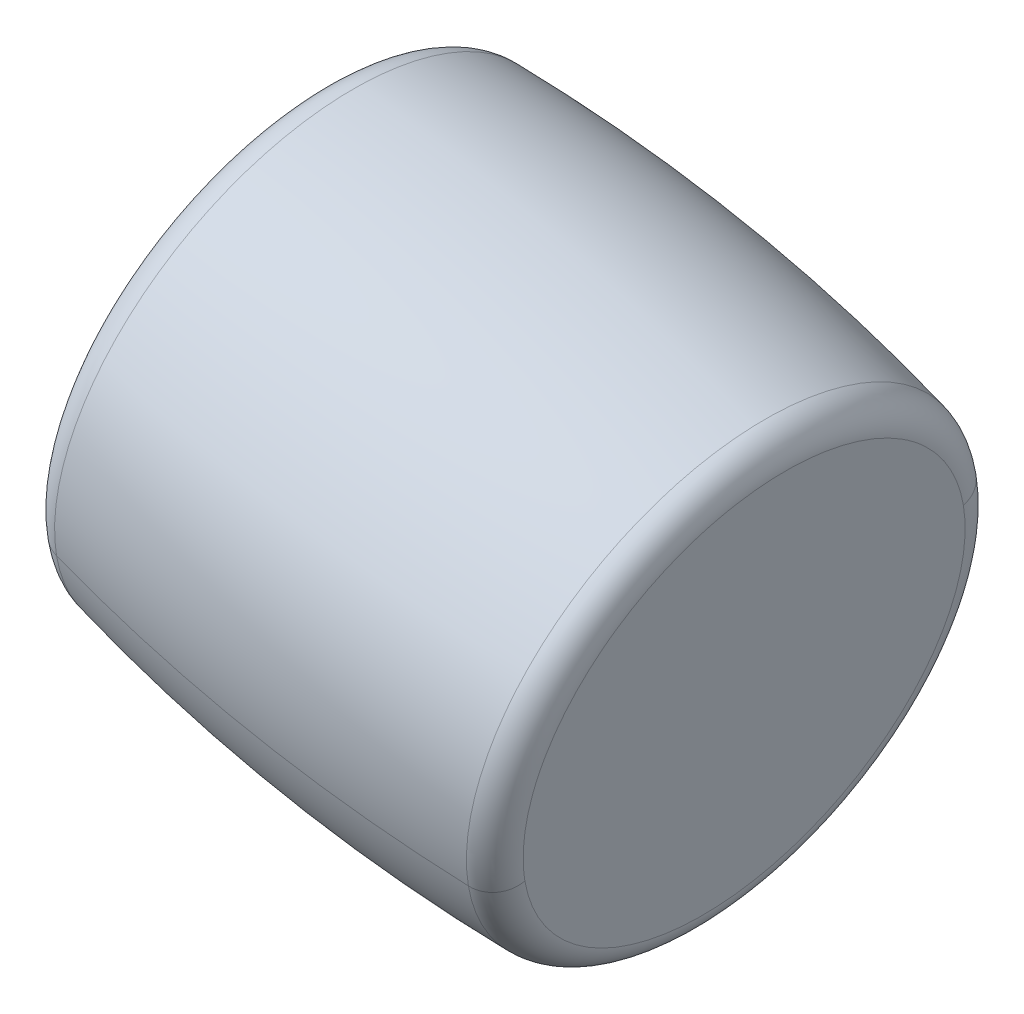
ISO-10303-21;
HEADER;
FILE_DESCRIPTION(('STEP AP214'),'2;1');
FILE_NAME('part.step','',(''),(''),'','','');
FILE_SCHEMA(('AUTOMOTIVE_DESIGN { 1 0 10303 214 1 1 1 1 }'));
ENDSEC;
DATA;
#1=APPLICATION_CONTEXT('core data for automotive mechanical design processes');
#2=APPLICATION_PROTOCOL_DEFINITION('international standard','automotive_design',2000,#1);
#3=PRODUCT_CONTEXT('',#1,'mechanical');
#4=PRODUCT('Part','Part','',(#3));
#5=PRODUCT_RELATED_PRODUCT_CATEGORY('part','',(#4));
#6=PRODUCT_DEFINITION_FORMATION('','',#4);
#7=PRODUCT_DEFINITION_CONTEXT('part definition',#1,'design');
#8=PRODUCT_DEFINITION('design','',#6,#7);
#9=PRODUCT_DEFINITION_SHAPE('','',#8);
#10=(LENGTH_UNIT() NAMED_UNIT(*) SI_UNIT(.MILLI.,.METRE.));
#11=(NAMED_UNIT(*) PLANE_ANGLE_UNIT() SI_UNIT($,.RADIAN.));
#12=(NAMED_UNIT(*) SI_UNIT($,.STERADIAN.) SOLID_ANGLE_UNIT());
#13=UNCERTAINTY_MEASURE_WITH_UNIT(LENGTH_MEASURE(1.E-05),#10,'distance_accuracy_value','');
#14=(GEOMETRIC_REPRESENTATION_CONTEXT(3) GLOBAL_UNCERTAINTY_ASSIGNED_CONTEXT((#13)) GLOBAL_UNIT_ASSIGNED_CONTEXT((#10,
#11,#12)) REPRESENTATION_CONTEXT('',''));
#15=CARTESIAN_POINT('',(0.,0.,0.));
#16=DIRECTION('',(0.,0.,1.));
#17=DIRECTION('',(1.,0.,0.));
#18=AXIS2_PLACEMENT_3D('',#15,#16,#17);
#19=CARTESIAN_POINT('',(13.0290031111751,28.409978680119,0.));
#20=DIRECTION('',(0.981627183447671,-0.190808995376511,0.));
#21=DIRECTION('',(0.190808995376511,0.981627183447671,0.));
#22=AXIS2_PLACEMENT_3D('',#19,#20,#21);
#23=PLANE('',#22);
#24=CARTESIAN_POINT('',(12.7962261869708,27.2124452198777,3.75461180980776));
#25=CARTESIAN_POINT('',(12.7845038024625,27.1521387795786,3.73465175134584));
#26=CARTESIAN_POINT('',(12.7728750799275,27.0923141883607,3.71318133474192));
#27=CARTESIAN_POINT('',(12.7498325650509,26.973770725914,3.66727713971461));
#28=CARTESIAN_POINT('',(12.7384187727092,26.915051854685,3.64284336129123));
#29=CARTESIAN_POINT('',(12.7158337244655,26.798861854042,3.59106979708954));
#30=CARTESIAN_POINT('',(12.7046624685635,26.741390724628,3.56373001131123));
#31=CARTESIAN_POINT('',(12.6825893764139,26.6278345097651,3.50621070057928));
#32=CARTESIAN_POINT('',(12.6716875401664,26.5717494243162,3.47603117562563));
#33=CARTESIAN_POINT('',(12.6501795586601,26.4611004516827,3.412904983346));
#34=CARTESIAN_POINT('',(12.6395734134014,26.4065365644981,3.37995831602));
#35=CARTESIAN_POINT('',(12.6186823629008,26.2990614267474,3.31137723942624));
#36=CARTESIAN_POINT('',(12.6083974576589,26.2461501761812,3.27574283015847));
#37=CARTESIAN_POINT('',(12.5881736649935,26.1421077824062,3.20187210831755));
#38=CARTESIAN_POINT('',(12.57823477757,26.0909766391972,3.16363579574439));
#39=CARTESIAN_POINT('',(12.5587269640405,25.9906176387617,3.08465338400256));
#40=CARTESIAN_POINT('',(12.5491580379346,25.941389781535,3.04390728483388));
#41=CARTESIAN_POINT('',(12.5304131994621,25.8449559474922,2.96000346026449));
#42=CARTESIAN_POINT('',(12.5212372870954,25.797749970676,2.91684573486378));
#43=CARTESIAN_POINT('',(12.503300581667,25.7054736207313,2.8282226287206));
#44=CARTESIAN_POINT('',(12.4945397886054,25.6604032476028,2.78275724797812));
#45=CARTESIAN_POINT('',(12.4774544273077,25.5725066835248,2.68962836119583));
#46=CARTESIAN_POINT('',(12.4691298590718,25.5296804925753,2.64196485515601));
#47=CARTESIAN_POINT('',(12.4529370020389,25.4463754648967,2.54455454335065));
#48=CARTESIAN_POINT('',(12.4450687132419,25.4058966281675,2.49480773758511));
#49=CARTESIAN_POINT('',(12.4298073704841,25.3273838259936,2.39335067073781));
#50=CARTESIAN_POINT('',(12.4224143165232,25.2893498605489,2.34164040965606));
#51=CARTESIAN_POINT('',(12.4081212539521,25.2158184280979,2.23638100672536));
#52=CARTESIAN_POINT('',(12.4012212453418,25.1803209610915,2.1828318648764));
#53=CARTESIAN_POINT('',(12.3879308961969,25.1119480420246,2.07402370498414));
#54=CARTESIAN_POINT('',(12.3815405556623,25.0790725899639,2.01876468694083));
#55=CARTESIAN_POINT('',(12.3692849375589,25.0160229006318,1.90666989847452));
#56=CARTESIAN_POINT('',(12.3634196599901,24.9858486633604,1.8498341280515));
#57=CARTESIAN_POINT('',(12.3522282977856,24.9282740959873,1.73472275717493));
#58=CARTESIAN_POINT('',(12.34690221315,24.9008737658856,1.67644715672137));
#59=CARTESIAN_POINT('',(12.3368020678163,24.8489130226472,1.55859651680954));
#60=CARTESIAN_POINT('',(12.3320280071182,24.8243526095105,1.49902147735127));
#61=CARTESIAN_POINT('',(12.3230434107901,24.7781308683885,1.37871548091822));
#62=CARTESIAN_POINT('',(12.3188328751599,24.7564695404033,1.31798452394345));
#63=CARTESIAN_POINT('',(12.3109854725168,24.7160981536206,1.19551299867216));
#64=CARTESIAN_POINT('',(12.3073486055038,24.6973880948232,1.13377243037564));
#65=CARTESIAN_POINT('',(12.300657301626,24.6629643205867,1.00943042089772));
#66=CARTESIAN_POINT('',(12.2976028647613,24.6472506051476,0.946828979716321));
#67=CARTESIAN_POINT('',(12.292083779586,24.6188573733446,0.82091603682368));
#68=CARTESIAN_POINT('',(12.2896191312755,24.6061778569807,0.757604535112441));
#69=CARTESIAN_POINT('',(12.2852855607623,24.5838835693936,0.630423994113179));
#70=CARTESIAN_POINT('',(12.2834166385596,24.5742687981703,0.566554954825156));
#71=CARTESIAN_POINT('',(12.2802790226594,24.5581271636906,0.438413204782239));
#72=CARTESIAN_POINT('',(12.2790103289619,24.5516003004341,0.374140494027344));
#73=CARTESIAN_POINT('',(12.2770762264663,24.5416502056731,0.245346239640516));
#74=CARTESIAN_POINT('',(12.2764108176682,24.5382269741685,0.180824696008582));
#75=CARTESIAN_POINT('',(12.2756848879995,24.534492389776,0.0516882139177065));
#76=CARTESIAN_POINT('',(12.2756243671289,24.534181036888,-0.0129267245412356));
#77=CARTESIAN_POINT('',(12.2761083591152,24.5366709598049,-0.142094333239782));
#78=CARTESIAN_POINT('',(12.2766528719722,24.5394722356098,-0.206647003479387));
#79=CARTESIAN_POINT('',(12.2783456196344,24.5481806673938,-0.335534562702504));
#80=CARTESIAN_POINT('',(12.2794938544398,24.5540878233728,-0.399869451686017));
#81=CARTESIAN_POINT('',(12.2823912798006,24.5689937846488,-0.528166460014319));
#82=CARTESIAN_POINT('',(12.2841404703561,24.5779925899458,-0.592128579359109));
#83=CARTESIAN_POINT('',(12.288235593264,24.5990601709476,-0.719525958062042));
#84=CARTESIAN_POINT('',(12.2905815256164,24.6111289466524,-0.782961217420185));
#85=CARTESIAN_POINT('',(12.2958644805616,24.638307393732,-0.90915205505376));
#86=CARTESIAN_POINT('',(12.2988015031544,24.6534170651068,-0.971907633329192));
#87=CARTESIAN_POINT('',(12.3052595630357,24.6866409030047,-1.09658792511254));
#88=CARTESIAN_POINT('',(12.3087806003243,24.7047550695277,-1.15851263862046));
#89=CARTESIAN_POINT('',(12.3163982071098,24.7439442591083,-1.28138201880997));
#90=CARTESIAN_POINT('',(12.3204947766068,24.7650192821658,-1.34232668549156));
#91=CARTESIAN_POINT('',(12.3292535788146,24.8100794132388,-1.46308915098827));
#92=CARTESIAN_POINT('',(12.3339158115253,24.8340645212543,-1.52290694980338));
#93=CARTESIAN_POINT('',(12.3437947084336,24.8848870400172,-1.64127157325037));
#94=CARTESIAN_POINT('',(12.3490113726311,24.9117244507646,-1.69981839788224));
#95=CARTESIAN_POINT('',(12.359986565112,24.9681869213182,-1.81550002853409));
#96=CARTESIAN_POINT('',(12.3657450933954,24.9978119811243,-1.87263483455408));
#97=CARTESIAN_POINT('',(12.3777901412488,25.0597783804314,-1.98535478523006));
#98=CARTESIAN_POINT('',(12.3840766608189,25.0921197199324,-2.04093992988605));
#99=CARTESIAN_POINT('',(12.3971625464697,25.1594407655095,-2.15042664835187));
#100=CARTESIAN_POINT('',(12.4039619125503,25.1944204715857,-2.2043282221617));
#101=CARTESIAN_POINT('',(12.4180571109537,25.2669339811374,-2.31031794532267));
#102=CARTESIAN_POINT('',(12.4253529432763,25.304467784613,-2.36240609467381));
#103=CARTESIAN_POINT('',(12.4404234978647,25.3819990667434,-2.46464348400323));
#104=CARTESIAN_POINT('',(12.4481982201303,25.4219965453982,-2.51479272398151));
#105=CARTESIAN_POINT('',(12.4642078246177,25.5043588204576,-2.61303148065356));
#106=CARTESIAN_POINT('',(12.4724427068394,25.5467236168622,-2.66112099734732));
#107=CARTESIAN_POINT('',(12.4893527926862,25.633718466916,-2.75512445559246));
#108=CARTESIAN_POINT('',(12.4980279963114,25.6783485205652,-2.80103839714385));
#109=CARTESIAN_POINT('',(12.5157978256398,25.7697663673997,-2.89058009439745));
#110=CARTESIAN_POINT('',(12.524892451343,25.8165541605851,-2.93420785009967));
#111=CARTESIAN_POINT('',(12.5434792150776,25.9121747706,-3.01907207257011));
#112=CARTESIAN_POINT('',(12.552971353109,25.9610075874297,-3.06030853933834));
#113=CARTESIAN_POINT('',(12.5723302741081,26.0606006022002,-3.14029084168047));
#114=CARTESIAN_POINT('',(12.5821970570757,26.1113608001411,-3.17903667725438));
#115=CARTESIAN_POINT('',(12.6022814980028,26.2146862913712,-3.25394437509624));
#116=CARTESIAN_POINT('',(12.6124991559623,26.2672515846605,-3.29010623736419));
#117=CARTESIAN_POINT('',(12.6332607316401,26.3740606321917,-3.35975887150052));
#118=CARTESIAN_POINT('',(12.6438046493585,26.4283043864336,-3.39324964336891));
#119=CARTESIAN_POINT('',(12.6651933433327,26.5383396779149,-3.45747941450325));
#120=CARTESIAN_POINT('',(12.6760381195885,26.5941312151544,-3.4882184137692));
#121=CARTESIAN_POINT('',(12.6980024046219,26.7071276659307,-3.546870586757));
#122=CARTESIAN_POINT('',(12.7091219133994,26.7643325794677,-3.57478376047886));
#123=CARTESIAN_POINT('',(12.7316088756055,26.8800179711919,-3.62771703709809));
#124=CARTESIAN_POINT('',(12.742976329034,26.9384984493791,-3.65273713999547));
#125=CARTESIAN_POINT('',(12.7659317953512,27.0565940858095,-3.69982399934631));
#126=CARTESIAN_POINT('',(12.7775198082398,27.1162092440527,-3.72189075579977));
#127=CARTESIAN_POINT('',(12.800888476939,27.2364306224573,-3.76301776151387));
#128=CARTESIAN_POINT('',(12.8126691327497,27.2970368426187,-3.78207801077451));
#129=CARTESIAN_POINT('',(12.8363947066612,27.4190943391667,-3.81714608429222));
#130=CARTESIAN_POINT('',(12.8483396247622,27.4805456155532,-3.8331539085493));
#131=CARTESIAN_POINT('',(12.8723649469005,27.6041451830449,-3.86207856781209));
#132=CARTESIAN_POINT('',(12.8844453509379,27.66629347415,-3.87499540281782));
#133=CARTESIAN_POINT('',(12.9087125421971,27.7911373503991,-3.89770696577992));
#134=CARTESIAN_POINT('',(12.920899329419,27.8538329355431,-3.90750169373629));
#135=CARTESIAN_POINT('',(12.9453499280114,27.9796203607248,-3.92394544628351));
#136=CARTESIAN_POINT('',(12.957613739382,28.0427122007625,-3.93059447087436));
#137=CARTESIAN_POINT('',(12.9821888416682,28.1691401419218,-3.94073079845345));
#138=CARTESIAN_POINT('',(12.9945001325838,28.2324762430433,-3.94421810144169));
#139=CARTESIAN_POINT('',(13.0191405350116,28.3592401243085,-3.94802258517366));
#140=CARTESIAN_POINT('',(13.0314696465238,28.4226679044521,-3.94833976591739));
#141=CARTESIAN_POINT('',(13.056115988124,28.5494623401104,-3.94580323889279));
#142=CARTESIAN_POINT('',(13.068433218212,28.612828995625,-3.94294953112445));
#143=CARTESIAN_POINT('',(13.0930261240933,28.7393485283412,-3.93407810993671));
#144=CARTESIAN_POINT('',(13.1053017998867,28.8025014055429,-3.92806039651731));
#145=CARTESIAN_POINT('',(13.1297820224486,28.9284412328357,-3.91287543126139));
#146=CARTESIAN_POINT('',(13.1419865692172,28.9912281829269,-3.90370817942486));
#147=CARTESIAN_POINT('',(13.1662951376997,29.1162849265361,-3.88224633387739));
#148=CARTESIAN_POINT('',(13.1783991594137,29.1785547200542,-3.86995174016644));
#149=CARTESIAN_POINT('',(13.2024774965208,29.3024270259167,-3.84226441226774));
#150=CARTESIAN_POINT('',(13.214451811914,29.3640295382613,-3.82687167807998));
#151=CARTESIAN_POINT('',(13.2382419698835,29.4864192909838,-3.79302670926456));
#152=CARTESIAN_POINT('',(13.2500578124598,29.5472065313618,-3.77457447463691));
#153=CARTESIAN_POINT('',(13.2617800353796,29.6075121403602,-3.75461180980776));
#154=B_SPLINE_CURVE_WITH_KNOTS('',3,(#24,#25,#26,#27,#28,#29,#30,#31,#32,#33,#34,#35,#36,#37,
#38,#39,#40,#41,#42,#43,#44,#45,#46,#47,#48,#49,#50,#51,#52,#53,#54,#55,#56,#57,#58,#59,#60,#61,
#62,#63,#64,#65,#66,#67,#68,#69,#70,#71,#72,#73,#74,#75,#76,#77,#78,#79,#80,#81,#82,#83,#84,#85,
#86,#87,#88,#89,#90,#91,#92,#93,#94,#95,#96,#97,#98,#99,#100,#101,#102,#103,#104,#105,#106,#107,
#108,#109,#110,#111,#112,#113,#114,#115,#116,#117,#118,#119,#120,#121,#122,#123,#124,#125,#126,
#127,#128,#129,#130,#131,#132,#133,#134,#135,#136,#137,#138,#139,#140,#141,#142,#143,#144,#145,
#146,#147,#148,#149,#150,#151,#152,#153),.UNSPECIFIED.,.F.,.F.,(4,2,2,2,2,2,2,2,2,2,2,2,2,2,2,2,
2,2,2,2,2,2,2,2,2,2,2,2,2,2,2,2,2,2,2,2,2,2,2,2,2,2,2,2,2,2,2,2,2,2,2,2,2,2,2,2,2,2,2,2,2,2,2,2,
4),(0.,0.193769318353994,0.387538636707985,0.58130795506198,0.775077273415972,0.968846591769964,
1.16261591012396,1.35638522847795,1.55015454683194,1.74392386518593,1.93769318353992,
2.13146250189392,2.32523182024791,2.5190011386019,2.7127704569559,2.90653977530989,
3.10030909366388,3.29407841201787,3.48784773037187,3.68161704872586,3.87538636707985,
4.06915568543385,4.26292500378784,4.45669432214183,4.65046364049582,4.84423295884982,
5.03800227720381,5.2317715955578,5.42554091391179,5.61931023226579,5.81307955061978,
6.00684886897377,6.20061818732776,6.39438750568175,6.58815682403575,6.78192614238974,
6.97569546074373,7.16946477909772,7.36323409745172,7.55700341580571,7.7507727341597,
7.94454205251369,8.13831137086769,8.33208068922168,8.52585000757567,8.71961932592967,
8.91338864428365,9.10715796263765,9.30092728099164,9.49469659934564,9.68846591769963,
9.88223523605362,10.0760045544076,10.2697738727616,10.4635431911156,10.6573125094696,
10.8510818278236,11.0448511461776,11.2386204645316,11.4323897828856,11.6261591012395,
11.8199284195935,12.0136977379475,12.2074670563015,12.4012363746555),.UNSPECIFIED.);
#155=CARTESIAN_POINT('',(12.7962261869708,27.2124452198777,3.75461180980776));
#156=VERTEX_POINT('',#155);
#157=CARTESIAN_POINT('',(13.2617800353796,29.6075121403602,-3.75461180980776));
#158=VERTEX_POINT('',#157);
#159=EDGE_CURVE('E12',#156,#158,#154,.T.);
#160=ORIENTED_EDGE('',*,*,#159,.F.);
#161=CARTESIAN_POINT('',(13.2617800353796,29.6075121403602,-3.75461180980776));
#162=CARTESIAN_POINT('',(13.273502419888,29.6678185806594,-3.73465175134584));
#163=CARTESIAN_POINT('',(13.2851311424229,29.7276431718772,-3.71318133474192));
#164=CARTESIAN_POINT('',(13.3081736572996,29.8461866343239,-3.66727713971461));
#165=CARTESIAN_POINT('',(13.3195874496413,29.9049055055529,-3.64284336129123));
#166=CARTESIAN_POINT('',(13.342172497885,30.0210955061959,-3.59106979708954));
#167=CARTESIAN_POINT('',(13.353343753787,30.0785666356099,-3.56373001131123));
#168=CARTESIAN_POINT('',(13.3754168459365,30.1921228504728,-3.50621070057928));
#169=CARTESIAN_POINT('',(13.3863186821841,30.2482079359217,-3.47603117562563));
#170=CARTESIAN_POINT('',(13.4078266636904,30.3588569085552,-3.412904983346));
#171=CARTESIAN_POINT('',(13.4184328089491,30.4134207957398,-3.37995831602001));
#172=CARTESIAN_POINT('',(13.4393238594497,30.5208959334905,-3.31137723942624));
#173=CARTESIAN_POINT('',(13.4496087646916,30.5738071840567,-3.27574283015848));
#174=CARTESIAN_POINT('',(13.469832557357,30.6778495778317,-3.20187210831755));
#175=CARTESIAN_POINT('',(13.4797714447805,30.7289807210407,-3.16363579574439));
#176=CARTESIAN_POINT('',(13.4992792583099,30.8293397214763,-3.08465338400256));
#177=CARTESIAN_POINT('',(13.5088481844158,30.8785675787029,-3.04390728483388));
#178=CARTESIAN_POINT('',(13.5275930228884,30.9750014127457,-2.96000346026449));
#179=CARTESIAN_POINT('',(13.5367689352551,31.0222073895619,-2.91684573486378));
#180=CARTESIAN_POINT('',(13.5547056406834,31.1144837395066,-2.8282226287206));
#181=CARTESIAN_POINT('',(13.5634664337451,31.1595541126351,-2.78275724797812));
#182=CARTESIAN_POINT('',(13.5805517950427,31.2474506767131,-2.68962836119583));
#183=CARTESIAN_POINT('',(13.5888763632787,31.2902768676626,-2.64196485515601));
#184=CARTESIAN_POINT('',(13.6050692203116,31.3735818953412,-2.54455454335065));
#185=CARTESIAN_POINT('',(13.6129375091085,31.4140607320704,-2.49480773758511));
#186=CARTESIAN_POINT('',(13.6281988518664,31.4925735342443,-2.39335067073782));
#187=CARTESIAN_POINT('',(13.6355919058272,31.530607499689,-2.34164040965607));
#188=CARTESIAN_POINT('',(13.6498849683984,31.60413893214,-2.23638100672536));
#189=CARTESIAN_POINT('',(13.6567849770087,31.6396363991464,-2.1828318648764));
#190=CARTESIAN_POINT('',(13.6700753261536,31.7080093182133,-2.07402370498414));
#191=CARTESIAN_POINT('',(13.6764656666882,31.740884770274,-2.01876468694084));
#192=CARTESIAN_POINT('',(13.6887212847916,31.8039344596061,-1.90666989847452));
#193=CARTESIAN_POINT('',(13.6945865623604,31.8341086968775,-1.84983412805151));
#194=CARTESIAN_POINT('',(13.7057779245648,31.8916832642506,-1.73472275717493));
#195=CARTESIAN_POINT('',(13.7111040092005,31.9190835943523,-1.67644715672137));
#196=CARTESIAN_POINT('',(13.7212041545342,31.9710443375907,-1.55859651680954));
#197=CARTESIAN_POINT('',(13.7259782152322,31.9956047507274,-1.49902147735127));
#198=CARTESIAN_POINT('',(13.7349628115604,32.0418264918494,-1.37871548091822));
#199=CARTESIAN_POINT('',(13.7391733471905,32.0634878198347,-1.31798452394345));
#200=CARTESIAN_POINT('',(13.7470207498337,32.1038592066173,-1.19551299867216));
#201=CARTESIAN_POINT('',(13.7506576168467,32.1225692654147,-1.13377243037564));
#202=CARTESIAN_POINT('',(13.7573489207244,32.1569930396512,-1.00943042089772));
#203=CARTESIAN_POINT('',(13.7604033575892,32.1727067550903,-0.946828979716324));
#204=CARTESIAN_POINT('',(13.7659224427645,32.2010999868933,-0.820916036823685));
#205=CARTESIAN_POINT('',(13.768387091075,32.2137795032572,-0.757604535112445));
#206=CARTESIAN_POINT('',(13.7727206615882,32.2360737908443,-0.630423994113183));
#207=CARTESIAN_POINT('',(13.7745895837909,32.2456885620676,-0.56655495482516));
#208=CARTESIAN_POINT('',(13.777727199691,32.2618301965473,-0.438413204782243));
#209=CARTESIAN_POINT('',(13.7789958933885,32.2683570598038,-0.374140494027348));
#210=CARTESIAN_POINT('',(13.7809299958841,32.2783071545648,-0.24534623964052));
#211=CARTESIAN_POINT('',(13.7815954046822,32.2817303860694,-0.180824696008586));
#212=CARTESIAN_POINT('',(13.7823213343509,32.2854649704619,-0.0516882139177098));
#213=CARTESIAN_POINT('',(13.7823818552216,32.2857763233499,0.0129267245412328));
#214=CARTESIAN_POINT('',(13.7818978632352,32.283286400433,0.14209433323978));
#215=CARTESIAN_POINT('',(13.7813533503783,32.2804851246281,0.206647003479384));
#216=CARTESIAN_POINT('',(13.779660602716,32.2717766928441,0.335534562702501));
#217=CARTESIAN_POINT('',(13.7785123679107,32.2658695368651,0.399869451686013));
#218=CARTESIAN_POINT('',(13.7756149425499,32.2509635755891,0.528166460014314));
#219=CARTESIAN_POINT('',(13.7738657519944,32.2419647702921,0.592128579359102));
#220=CARTESIAN_POINT('',(13.7697706290865,32.2208971892903,0.719525958062035));
#221=CARTESIAN_POINT('',(13.7674246967341,32.2088284135856,0.78296121742018));
#222=CARTESIAN_POINT('',(13.7621417417889,32.1816499665059,0.909152055053757));
#223=CARTESIAN_POINT('',(13.7592047191961,32.1665402951311,0.97190763332919));
#224=CARTESIAN_POINT('',(13.7527466593147,32.1333164572333,1.09658792511254));
#225=CARTESIAN_POINT('',(13.7492256220262,32.1152022907102,1.15851263862045));
#226=CARTESIAN_POINT('',(13.7416080152407,32.0760131011296,1.28138201880996));
#227=CARTESIAN_POINT('',(13.7375114457437,32.0549380780721,1.34232668549156));
#228=CARTESIAN_POINT('',(13.7287526435359,32.0098779469991,1.46308915098827));
#229=CARTESIAN_POINT('',(13.7240904108252,31.9858928389836,1.52290694980338));
#230=CARTESIAN_POINT('',(13.7142115139169,31.9350703202207,1.64127157325036));
#231=CARTESIAN_POINT('',(13.7089948497193,31.9082329094733,1.69981839788223));
#232=CARTESIAN_POINT('',(13.6980196572385,31.8517704389197,1.81550002853409));
#233=CARTESIAN_POINT('',(13.6922611289551,31.8221453791136,1.87263483455408));
#234=CARTESIAN_POINT('',(13.6802160811017,31.7601789798065,1.98535478523006));
#235=CARTESIAN_POINT('',(13.6739295615315,31.7278376403055,2.04093992988605));
#236=CARTESIAN_POINT('',(13.6608436758808,31.6605165947284,2.15042664835187));
#237=CARTESIAN_POINT('',(13.6540443098001,31.6255368886522,2.20432822216169));
#238=CARTESIAN_POINT('',(13.6399491113968,31.5530233791005,2.31031794532266));
#239=CARTESIAN_POINT('',(13.6326532790741,31.5154895756249,2.3624060946738));
#240=CARTESIAN_POINT('',(13.6175827244858,31.4379582934945,2.46464348400323));
#241=CARTESIAN_POINT('',(13.6098080022201,31.3979608148397,2.51479272398151));
#242=CARTESIAN_POINT('',(13.5937983977328,31.3155985397803,2.61303148065356));
#243=CARTESIAN_POINT('',(13.5855635155111,31.2732337433757,2.66112099734732));
#244=CARTESIAN_POINT('',(13.5686534296643,31.1862388933219,2.75512445559246));
#245=CARTESIAN_POINT('',(13.5599782260391,31.1416088396727,2.80103839714384));
#246=CARTESIAN_POINT('',(13.5422083967107,31.0501909928382,2.89058009439744));
#247=CARTESIAN_POINT('',(13.5331137710075,31.0034031996528,2.93420785009966));
#248=CARTESIAN_POINT('',(13.5145270072728,30.9077825896379,3.01907207257011));
#249=CARTESIAN_POINT('',(13.5050348692414,30.8589497728083,3.06030853933834));
#250=CARTESIAN_POINT('',(13.4856759482424,30.7593567580377,3.14029084168047));
#251=CARTESIAN_POINT('',(13.4758091652747,30.7085965600968,3.17903667725438));
#252=CARTESIAN_POINT('',(13.4557247243476,30.6052710688667,3.25394437509623));
#253=CARTESIAN_POINT('',(13.4455070663881,30.5527057755774,3.29010623736418));
#254=CARTESIAN_POINT('',(13.4247454907103,30.4458967280462,3.35975887150052));
#255=CARTESIAN_POINT('',(13.414201572992,30.3916529738043,3.39324964336891));
#256=CARTESIAN_POINT('',(13.3928128790178,30.281617682323,3.45747941450325));
#257=CARTESIAN_POINT('',(13.3819681027619,30.2258261450835,3.48821841376919));
#258=CARTESIAN_POINT('',(13.3600038177286,30.1128296943072,3.546870586757));
#259=CARTESIAN_POINT('',(13.3488843089511,30.0556247807702,3.57478376047886));
#260=CARTESIAN_POINT('',(13.326397346745,29.9399393890461,3.62771703709809));
#261=CARTESIAN_POINT('',(13.3150298933164,29.8814589108588,3.65273713999547));
#262=CARTESIAN_POINT('',(13.2920744269993,29.7633632744284,3.69982399934631));
#263=CARTESIAN_POINT('',(13.2804864141107,29.7037481161852,3.72189075579977));
#264=CARTESIAN_POINT('',(13.2571177454114,29.5835267377806,3.76301776151387));
#265=CARTESIAN_POINT('',(13.2453370896008,29.5229205176192,3.78207801077451));
#266=CARTESIAN_POINT('',(13.2216115156892,29.4008630210712,3.81714608429222));
#267=CARTESIAN_POINT('',(13.2096665975883,29.3394117446847,3.83315390854929));
#268=CARTESIAN_POINT('',(13.18564127545,29.215812177193,3.86207856781209));
#269=CARTESIAN_POINT('',(13.1735608714126,29.1536638860879,3.87499540281782));
#270=CARTESIAN_POINT('',(13.1492936801534,29.0288200098388,3.89770696577991));
#271=CARTESIAN_POINT('',(13.1371068929315,28.9661244246948,3.90750169373629));
#272=CARTESIAN_POINT('',(13.112656294339,28.8403369995131,3.92394544628351));
#273=CARTESIAN_POINT('',(13.1003924829684,28.7772451594754,3.93059447087436));
#274=CARTESIAN_POINT('',(13.0758173806823,28.6508172183161,3.94073079845345));
#275=CARTESIAN_POINT('',(13.0635060897667,28.5874811171946,3.94421810144169));
#276=CARTESIAN_POINT('',(13.0388656873389,28.4607172359295,3.94802258517366));
#277=CARTESIAN_POINT('',(13.0265365758266,28.3972894557858,3.94833976591739));
#278=CARTESIAN_POINT('',(13.0018902342264,28.2704950201275,3.94580323889279));
#279=CARTESIAN_POINT('',(12.9895730041385,28.2071283646129,3.94294953112445));
#280=CARTESIAN_POINT('',(12.9649800982572,28.0806088318967,3.93407810993671));
#281=CARTESIAN_POINT('',(12.9527044224638,28.017455954695,3.92806039651731));
#282=CARTESIAN_POINT('',(12.9282241999018,27.8915161274022,3.91287543126139));
#283=CARTESIAN_POINT('',(12.9160196531333,27.828729177311,3.90370817942486));
#284=CARTESIAN_POINT('',(12.8917110846508,27.7036724337018,3.88224633387739));
#285=CARTESIAN_POINT('',(12.8796070629368,27.6414026401837,3.86995174016644));
#286=CARTESIAN_POINT('',(12.8555287258296,27.5175303343212,3.84226441226774));
#287=CARTESIAN_POINT('',(12.8435544104365,27.4559278219767,3.82687167807998));
#288=CARTESIAN_POINT('',(12.819764252467,27.3335380692541,3.79302670926457));
#289=CARTESIAN_POINT('',(12.8079484098907,27.2727508288761,3.77457447463691));
#290=CARTESIAN_POINT('',(12.7962261869708,27.2124452198777,3.75461180980776));
#291=B_SPLINE_CURVE_WITH_KNOTS('',3,(#161,#162,#163,#164,#165,#166,#167,#168,#169,#170,#171,
#172,#173,#174,#175,#176,#177,#178,#179,#180,#181,#182,#183,#184,#185,#186,#187,#188,#189,#190,
#191,#192,#193,#194,#195,#196,#197,#198,#199,#200,#201,#202,#203,#204,#205,#206,#207,#208,#209,
#210,#211,#212,#213,#214,#215,#216,#217,#218,#219,#220,#221,#222,#223,#224,#225,#226,#227,#228,
#229,#230,#231,#232,#233,#234,#235,#236,#237,#238,#239,#240,#241,#242,#243,#244,#245,#246,#247,
#248,#249,#250,#251,#252,#253,#254,#255,#256,#257,#258,#259,#260,#261,#262,#263,#264,#265,#266,
#267,#268,#269,#270,#271,#272,#273,#274,#275,#276,#277,#278,#279,#280,#281,#282,#283,#284,#285,
#286,#287,#288,#289,#290),.UNSPECIFIED.,.F.,.F.,(4,2,2,2,2,2,2,2,2,2,2,2,2,2,2,2,2,2,2,2,2,2,2,
2,2,2,2,2,2,2,2,2,2,2,2,2,2,2,2,2,2,2,2,2,2,2,2,2,2,2,2,2,2,2,2,2,2,2,2,2,2,2,2,2,4),(0.,
0.193769318353991,0.387538636707982,0.581307955061976,0.775077273415966,0.968846591769961,
1.16261591012395,1.35638522847795,1.55015454683194,1.74392386518593,1.93769318353992,
2.13146250189392,2.32523182024791,2.5190011386019,2.71277045695589,2.90653977530988,
3.10030909366388,3.29407841201787,3.48784773037186,3.68161704872586,3.87538636707985,
4.06915568543384,4.26292500378783,4.45669432214182,4.65046364049582,4.84423295884981,
5.0380022772038,5.23177159555779,5.42554091391179,5.61931023226578,5.81307955061977,
6.00684886897376,6.20061818732776,6.39438750568175,6.58815682403574,6.78192614238974,
6.97569546074372,7.16946477909772,7.36323409745171,7.55700341580571,7.7507727341597,
7.94454205251369,8.13831137086768,8.33208068922167,8.52585000757566,8.71961932592966,
8.91338864428365,9.10715796263764,9.30092728099164,9.49469659934563,9.68846591769962,
9.88223523605361,10.0760045544076,10.2697738727616,10.4635431911156,10.6573125094696,
10.8510818278236,11.0448511461776,11.2386204645316,11.4323897828855,11.6261591012395,
11.8199284195935,12.0136977379475,12.2074670563015,12.4012363746555),.UNSPECIFIED.);
#292=EDGE_CURVE('E29',#158,#156,#291,.T.);
#293=ORIENTED_EDGE('',*,*,#292,.F.);
#294=EDGE_LOOP('',(#160,#293));
#295=FACE_BOUND('',#294,.T.);
#296=ADVANCED_FACE('F19',(#295),#23,.F.);
#297=CARTESIAN_POINT('',(13.5688980620716,28.3050337326619,0.));
#298=DIRECTION('',(0.981627183447671,-0.190808995376511,0.));
#299=DIRECTION('',(-0.181470138420563,-0.933582929390365,-0.309016994374947));
#300=AXIS2_PLACEMENT_3D('',#297,#298,#299);
#301=TOROIDAL_SURFACE('',#300,3.94783248469173,0.550000000000109);
#302=CARTESIAN_POINT('',(13.801674986276,29.5025671929031,-3.75461180980776));
#303=DIRECTION('',(0.181470138420563,0.933582929390365,0.309016994374948));
#304=DIRECTION('',(-0.057354781826496,0.323747282757365,-0.944403582113525));
#305=AXIS2_PLACEMENT_3D('',#302,#303,#304);
#306=CIRCLE('',#305,0.550000000000109);
#307=CARTESIAN_POINT('',(13.7701298562714,29.6806281984197,-4.2740337799703));
#308=VERTEX_POINT('',#307);
#309=EDGE_CURVE('E189',#308,#158,#306,.T.);
#310=ORIENTED_EDGE('',*,*,#309,.T.);
#311=ORIENTED_EDGE('',*,*,#292,.T.);
#312=CARTESIAN_POINT('',(13.3361211378672,27.1075002724206,3.75461180980776));
#313=DIRECTION('',(-0.181470138420562,-0.933582929390363,-0.309016994374953));
#314=DIRECTION('',(-0.174456294413103,-0.278687774096378,0.944403582113524));
#315=AXIS2_PLACEMENT_3D('',#312,#313,#314);
#316=CIRCLE('',#315,0.55000000000011);
#317=CARTESIAN_POINT('',(13.2401701759399,26.9542219966676,4.2740337799703));
#318=VERTEX_POINT('',#317);
#319=EDGE_CURVE('E185',#318,#156,#316,.T.);
#320=ORIENTED_EDGE('',*,*,#319,.F.);
#321=CARTESIAN_POINT('',(13.5051500161057,28.3174250975437,0.));
#322=DIRECTION('',(0.981627183447671,-0.190808995376511,0.));
#323=DIRECTION('',(0.0589632222509516,0.303339481825739,-0.951056516295155));
#324=AXIS2_PLACEMENT_3D('',#321,#322,#323);
#325=CIRCLE('',#324,4.49398506475706);
#326=EDGE_CURVE('E181',#308,#318,#325,.T.);
#327=ORIENTED_EDGE('',*,*,#326,.F.);
#328=EDGE_LOOP('',(#310,#311,#320,#327));
#329=FACE_BOUND('',#328,.T.);
#330=ADVANCED_FACE('F157',(#329),#301,.T.);
#331=CARTESIAN_POINT('',(17.2499999999975,27.5895000000005,0.));
#332=DIRECTION('',(0.981627183447671,-0.190808995376511,0.));
#333=DIRECTION('',(-0.181470138420563,-0.933582929390365,-0.309016994374948));
#334=AXIS2_PLACEMENT_3D('',#331,#332,#333);
#335=DEGENERATE_TOROIDAL_SURFACE('',#334,27.5894999999532,32.3094999999531,.F.);
#336=CARTESIAN_POINT('',(15.6232341797076,19.2205153661833,26.2391737562806));
#337=DIRECTION('',(0.181470138420563,0.933582929390365,0.309016994374948));
#338=DIRECTION('',(0.174456294413751,0.278687774096222,-0.94440358211345));
#339=AXIS2_PLACEMENT_3D('',#336,#337,#338);
#340=CIRCLE('',#339,32.3094999999531);
#341=CARTESIAN_POINT('',(21.2598298240605,28.2247780033321,-4.27403377996964));
#342=VERTEX_POINT('',#341);
#343=EDGE_CURVE('E110',#342,#308,#340,.T.);
#344=ORIENTED_EDGE('',*,*,#343,.T.);
#345=ORIENTED_EDGE('',*,*,#326,.T.);
#346=CARTESIAN_POINT('',(18.8767658202873,35.9584846338177,-26.2391737562806));
#347=DIRECTION('',(-0.181470138420563,-0.933582929390365,-0.309016994374948));
#348=DIRECTION('',(0.0573547818271538,-0.323747282757467,0.94440358211345));
#349=AXIS2_PLACEMENT_3D('',#346,#347,#348);
#350=CIRCLE('',#349,32.3094999999531);
#351=CARTESIAN_POINT('',(20.7298701437291,25.4983718015805,4.27403377996964));
#352=VERTEX_POINT('',#351);
#353=EDGE_CURVE('E88',#352,#318,#350,.T.);
#354=ORIENTED_EDGE('',*,*,#353,.F.);
#355=CARTESIAN_POINT('',(20.9948499838948,26.8615749024563,0.));
#356=DIRECTION('',(0.981627183447671,-0.190808995376511,0.));
#357=DIRECTION('',(0.0589632222509521,0.303339481825742,-0.951056516295154));
#358=AXIS2_PLACEMENT_3D('',#355,#356,#357);
#359=CIRCLE('',#358,4.49398506475639);
#360=EDGE_CURVE('E83',#342,#352,#359,.T.);
#361=ORIENTED_EDGE('',*,*,#360,.F.);
#362=EDGE_LOOP('',(#344,#345,#354,#361));
#363=FACE_BOUND('',#362,.T.);
#364=ADVANCED_FACE('F148',(#363),#335,.F.);
#365=CARTESIAN_POINT('',(20.9311019379307,26.8739662673377,0.));
#366=DIRECTION('',(0.981627183447671,-0.190808995376511,0.));
#367=DIRECTION('',(-0.181470138420632,-0.933582929390723,-0.309016994373826));
#368=AXIS2_PLACEMENT_3D('',#365,#366,#367);
#369=TOROIDAL_SURFACE('',#368,3.9478324846927,0.549999999998262);
#370=CARTESIAN_POINT('',(21.1638788621335,28.0714997275705,-3.75461180981156));
#371=DIRECTION('',(0.1814701384207,0.933582929391081,0.309016994372704));
#372=DIRECTION('',(0.981627183447671,-0.190808995376508,0.));
#373=AXIS2_PLACEMENT_3D('',#370,#371,#372);
#374=CIRCLE('',#373,0.549999999998259);
#375=CARTESIAN_POINT('',(21.703773813028,27.9665547801138,-3.75461180981156));
#376=VERTEX_POINT('',#375);
#377=EDGE_CURVE('E64',#376,#342,#374,.T.);
#378=ORIENTED_EDGE('',*,*,#377,.T.);
#379=ORIENTED_EDGE('',*,*,#360,.T.);
#380=CARTESIAN_POINT('',(20.6983250137262,25.6764328070962,3.75461180980868));
#381=DIRECTION('',(-0.181470138420566,-0.933582929390365,-0.309016994374947));
#382=DIRECTION('',(0.98162718344767,-0.190808995376515,0.));
#383=AXIS2_PLACEMENT_3D('',#380,#381,#382);
#384=CIRCLE('',#383,0.54999999999826);
#385=CARTESIAN_POINT('',(21.2382199646207,25.5714878596394,3.75461180980868));
#386=VERTEX_POINT('',#385);
#387=EDGE_CURVE('E66',#386,#352,#384,.T.);
#388=ORIENTED_EDGE('',*,*,#387,.F.);
#389=CARTESIAN_POINT('',(21.7037738130278,27.9665547801135,-3.75461180981053));
#390=CARTESIAN_POINT('',(21.8538123087029,28.738435925589,-3.49906589562838));
#391=CARTESIAN_POINT('',(21.9911297300572,29.4448728170798,-3.03790594602588));
#392=CARTESIAN_POINT('',(22.1018364370868,30.0144094513239,-2.39337832818179));
#393=CARTESIAN_POINT('',(22.2481927711338,30.7673475174085,-0.865784228785506));
#394=CARTESIAN_POINT('',(22.2330493054666,30.6894411402946,0.841744677898456));
#395=CARTESIAN_POINT('',(22.1819158776723,30.426382458985,1.66650929977611));
#396=CARTESIAN_POINT('',(22.0026597834514,29.5041897995736,3.09457850220338));
#397=CARTESIAN_POINT('',(21.712928143431,28.0136497273526,3.87957882720936));
#398=CARTESIAN_POINT('',(21.5510777257391,27.1810015110288,4.05998169037123));
#399=CARTESIAN_POINT('',(21.3882643362203,26.3433992341264,4.01006294734627));
#400=CARTESIAN_POINT('',(21.2382199646207,25.5714878596398,3.75461180980765));
#401=B_SPLINE_CURVE_WITH_KNOTS('',5,(#389,#390,#391,#392,#393,#394,#395,#396,#397,#398,#399,
#400),.UNSPECIFIED.,.F.,.F.,(6,3,3,6),(0.,1.04719755119739,2.09439510239477,3.14159265359216),.UNSPECIFIED.);
#402=EDGE_CURVE('E58',#376,#386,#401,.T.);
#403=ORIENTED_EDGE('',*,*,#402,.F.);
#404=EDGE_LOOP('',(#378,#379,#388,#403));
#405=FACE_BOUND('',#404,.T.);
#406=ADVANCED_FACE('F61',(#405),#369,.T.);
#407=CARTESIAN_POINT('',(22.2242788391439,30.6443210025521,0.));
#408=DIRECTION('',(-0.981627183447671,0.190808995376511,0.));
#409=DIRECTION('',(-0.190808995376511,-0.981627183447671,0.));
#410=AXIS2_PLACEMENT_3D('',#407,#408,#409);
#411=PLANE('',#410);
#412=ORIENTED_EDGE('',*,*,#402,.T.);
#413=CARTESIAN_POINT('',(21.4709968888252,26.7690213198809,0.));
#414=DIRECTION('',(0.981627183447671,-0.190808995376511,0.));
#415=DIRECTION('',(0.190808995376511,0.981627183447671,0.));
#416=AXIS2_PLACEMENT_3D('',#413,#414,#415);
#417=CIRCLE('',#416,3.94783248469161);
#418=EDGE_CURVE('E71',#386,#376,#417,.T.);
#419=ORIENTED_EDGE('',*,*,#418,.T.);
#420=EDGE_LOOP('',(#412,#419));
#421=FACE_BOUND('',#420,.T.);
#422=ADVANCED_FACE('F74',(#421),#411,.F.);
#423=CARTESIAN_POINT('',(20.9311019379307,26.8739662673377,0.));
#424=DIRECTION('',(0.981627183447671,-0.190808995376511,0.));
#425=DIRECTION('',(0.181470138420741,0.933582929391285,0.309016994372062));
#426=AXIS2_PLACEMENT_3D('',#423,#424,#425);
#427=TOROIDAL_SURFACE('',#426,3.9478324846927,0.549999999998262);
#428=ORIENTED_EDGE('',*,*,#377,.F.);
#429=ORIENTED_EDGE('',*,*,#418,.F.);
#430=ORIENTED_EDGE('',*,*,#387,.T.);
#431=CARTESIAN_POINT('',(20.9948499838948,26.8615749024563,0.));
#432=DIRECTION('',(0.981627183447671,-0.190808995376511,0.));
#433=DIRECTION('',(0.190808995376511,0.981627183447671,0.));
#434=AXIS2_PLACEMENT_3D('',#431,#432,#433);
#435=CIRCLE('',#434,4.49398506475639);
#436=EDGE_CURVE('E77',#352,#342,#435,.T.);
#437=ORIENTED_EDGE('',*,*,#436,.T.);
#438=EDGE_LOOP('',(#428,#429,#430,#437));
#439=FACE_BOUND('',#438,.T.);
#440=ADVANCED_FACE('F80',(#439),#427,.T.);
#441=CARTESIAN_POINT('',(17.2499999999975,27.5895000000005,0.));
#442=DIRECTION('',(0.981627183447671,-0.190808995376511,0.));
#443=DIRECTION('',(0.181470138420563,0.933582929390365,0.309016994374948));
#444=AXIS2_PLACEMENT_3D('',#441,#442,#443);
#445=DEGENERATE_TOROIDAL_SURFACE('',#444,27.5894999999532,32.3094999999531,.F.);
#446=ORIENTED_EDGE('',*,*,#343,.F.);
#447=ORIENTED_EDGE('',*,*,#436,.F.);
#448=ORIENTED_EDGE('',*,*,#353,.T.);
#449=CARTESIAN_POINT('',(13.5051500161057,28.3174250975437,0.));
#450=DIRECTION('',(0.981627183447671,-0.190808995376511,0.));
#451=DIRECTION('',(0.190808995376511,0.981627183447671,0.));
#452=AXIS2_PLACEMENT_3D('',#449,#450,#451);
#453=CIRCLE('',#452,4.49398506475706);
#454=EDGE_CURVE('E122',#318,#308,#453,.T.);
#455=ORIENTED_EDGE('',*,*,#454,.T.);
#456=EDGE_LOOP('',(#446,#447,#448,#455));
#457=FACE_BOUND('',#456,.T.);
#458=ADVANCED_FACE('F218',(#457),#445,.F.);
#459=CARTESIAN_POINT('',(13.5688980620716,28.3050337326619,0.));
#460=DIRECTION('',(0.981627183447671,-0.190808995376511,0.));
#461=DIRECTION('',(0.181470138420563,0.933582929390365,0.309016994374947));
#462=AXIS2_PLACEMENT_3D('',#459,#460,#461);
#463=TOROIDAL_SURFACE('',#462,3.94783248469173,0.550000000000109);
#464=ORIENTED_EDGE('',*,*,#309,.F.);
#465=ORIENTED_EDGE('',*,*,#454,.F.);
#466=ORIENTED_EDGE('',*,*,#319,.T.);
#467=ORIENTED_EDGE('',*,*,#159,.T.);
#468=EDGE_LOOP('',(#464,#465,#466,#467));
#469=FACE_BOUND('',#468,.T.);
#470=ADVANCED_FACE('F213',(#469),#463,.T.);
#471=CLOSED_SHELL('',(#296,#330,#364,#406,#422,#440,#458,#470));
#472=MANIFOLD_SOLID_BREP('B1',#471);
#473=ADVANCED_BREP_SHAPE_REPRESENTATION('',(#18,#472),#14);
#474=SHAPE_DEFINITION_REPRESENTATION(#9,#473);
ENDSEC;
END-ISO-10303-21;
